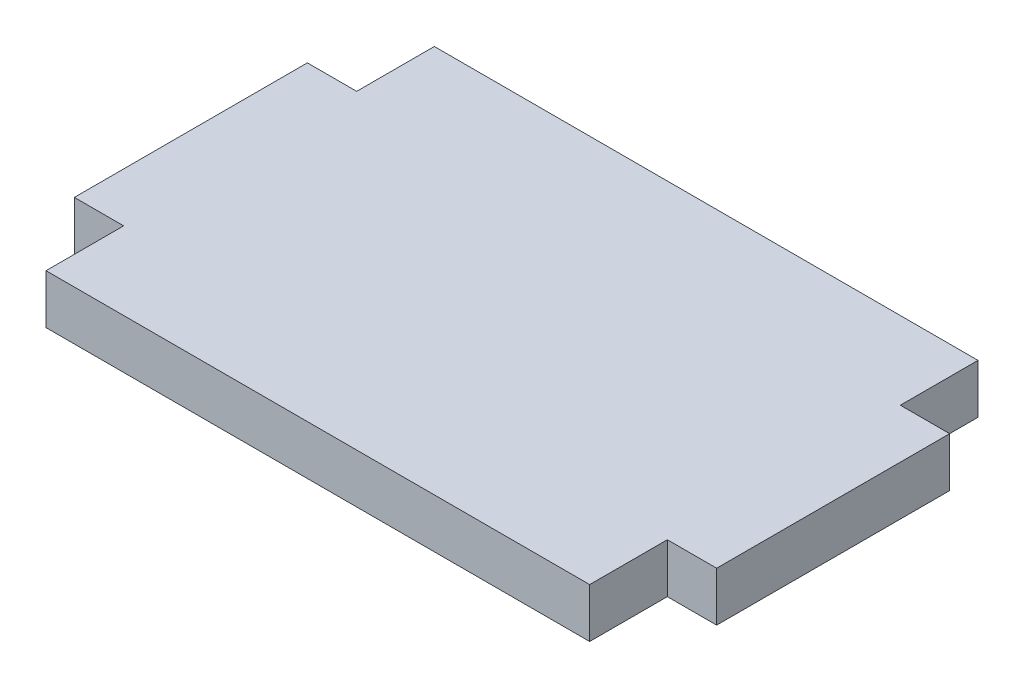
ISO-10303-21;
HEADER;
FILE_DESCRIPTION(('STEP AP214'),'2;1');
FILE_NAME('part.step','',(''),(''),'','','');
FILE_SCHEMA(('AUTOMOTIVE_DESIGN { 1 0 10303 214 1 1 1 1 }'));
ENDSEC;
DATA;
#1=APPLICATION_CONTEXT('core data for automotive mechanical design processes');
#2=APPLICATION_PROTOCOL_DEFINITION('international standard','automotive_design',2000,#1);
#3=PRODUCT_CONTEXT('',#1,'mechanical');
#4=PRODUCT('Part','Part','',(#3));
#5=PRODUCT_RELATED_PRODUCT_CATEGORY('part','',(#4));
#6=PRODUCT_DEFINITION_FORMATION('','',#4);
#7=PRODUCT_DEFINITION_CONTEXT('part definition',#1,'design');
#8=PRODUCT_DEFINITION('design','',#6,#7);
#9=PRODUCT_DEFINITION_SHAPE('','',#8);
#10=(LENGTH_UNIT() NAMED_UNIT(*) SI_UNIT(.MILLI.,.METRE.));
#11=(NAMED_UNIT(*) PLANE_ANGLE_UNIT() SI_UNIT($,.RADIAN.));
#12=(NAMED_UNIT(*) SI_UNIT($,.STERADIAN.) SOLID_ANGLE_UNIT());
#13=UNCERTAINTY_MEASURE_WITH_UNIT(LENGTH_MEASURE(1.E-05),#10,'distance_accuracy_value','');
#14=(GEOMETRIC_REPRESENTATION_CONTEXT(3) GLOBAL_UNCERTAINTY_ASSIGNED_CONTEXT((#13)) GLOBAL_UNIT_ASSIGNED_CONTEXT((#10,
#11,#12)) REPRESENTATION_CONTEXT('',''));
#15=CARTESIAN_POINT('',(0.,0.,0.));
#16=DIRECTION('',(0.,0.,1.));
#17=DIRECTION('',(1.,0.,0.));
#18=AXIS2_PLACEMENT_3D('',#15,#16,#17);
#19=CARTESIAN_POINT('',(-49.0760127478825,6.35,24.4949241036865));
#20=DIRECTION('',(1.,0.,0.));
#21=DIRECTION('',(0.,0.,-1.));
#22=AXIS2_PLACEMENT_3D('',#19,#20,#21);
#23=PLANE('',#22);
#24=DIRECTION('',(0.,0.,1.));
#25=VECTOR('',#24,1.);
#26=CARTESIAN_POINT('',(-49.0760127478825,0.,24.4949241036865));
#27=LINE('',#26,#25);
#28=CARTESIAN_POINT('',(-49.0760127478825,0.,-5.50507589631345));
#29=VERTEX_POINT('',#28);
#30=CARTESIAN_POINT('',(-49.0760127478825,0.,24.4949241036865));
#31=VERTEX_POINT('',#30);
#32=EDGE_CURVE('E151',#29,#31,#27,.T.);
#33=ORIENTED_EDGE('',*,*,#32,.T.);
#34=DIRECTION('',(0.,-1.,0.));
#35=VECTOR('',#34,1.);
#36=CARTESIAN_POINT('',(-49.0760127478825,6.35,24.4949241036865));
#37=LINE('',#36,#35);
#38=CARTESIAN_POINT('',(-49.0760127478825,6.35,24.4949241036865));
#39=VERTEX_POINT('',#38);
#40=EDGE_CURVE('E11',#39,#31,#37,.T.);
#41=ORIENTED_EDGE('',*,*,#40,.F.);
#42=DIRECTION('',(0.,0.,1.));
#43=VECTOR('',#42,1.);
#44=CARTESIAN_POINT('',(-49.0760127478825,6.35,24.4949241036865));
#45=LINE('',#44,#43);
#46=CARTESIAN_POINT('',(-49.0760127478825,6.35,-5.50507589631345));
#47=VERTEX_POINT('',#46);
#48=EDGE_CURVE('E173',#47,#39,#45,.T.);
#49=ORIENTED_EDGE('',*,*,#48,.F.);
#50=DIRECTION('',(0.,-1.,0.));
#51=VECTOR('',#50,1.);
#52=CARTESIAN_POINT('',(-49.0760127478825,6.35,-5.50507589631345));
#53=LINE('',#52,#51);
#54=EDGE_CURVE('E147',#47,#29,#53,.T.);
#55=ORIENTED_EDGE('',*,*,#54,.T.);
#56=EDGE_LOOP('',(#33,#41,#49,#55));
#57=FACE_BOUND('',#56,.T.);
#58=ADVANCED_FACE('F31',(#57),#23,.F.);
#59=CARTESIAN_POINT('',(-42.7260127478825,6.35,24.4949241036865));
#60=DIRECTION('',(0.,0.,-1.));
#61=DIRECTION('',(-1.,0.,0.));
#62=AXIS2_PLACEMENT_3D('',#59,#60,#61);
#63=PLANE('',#62);
#64=DIRECTION('',(1.,0.,0.));
#65=VECTOR('',#64,1.);
#66=CARTESIAN_POINT('',(-42.7260127478825,0.,24.4949241036865));
#67=LINE('',#66,#65);
#68=CARTESIAN_POINT('',(-42.7260127478825,0.,24.4949241036865));
#69=VERTEX_POINT('',#68);
#70=EDGE_CURVE('E154',#31,#69,#67,.T.);
#71=ORIENTED_EDGE('',*,*,#70,.T.);
#72=DIRECTION('',(0.,-1.,0.));
#73=VECTOR('',#72,1.);
#74=CARTESIAN_POINT('',(-42.7260127478825,6.35,24.4949241036865));
#75=LINE('',#74,#73);
#76=CARTESIAN_POINT('',(-42.7260127478825,6.35,24.4949241036865));
#77=VERTEX_POINT('',#76);
#78=EDGE_CURVE('E39',#77,#69,#75,.T.);
#79=ORIENTED_EDGE('',*,*,#78,.F.);
#80=DIRECTION('',(1.,0.,0.));
#81=VECTOR('',#80,1.);
#82=CARTESIAN_POINT('',(-42.7260127478825,6.35,24.4949241036865));
#83=LINE('',#82,#81);
#84=EDGE_CURVE('E102',#39,#77,#83,.T.);
#85=ORIENTED_EDGE('',*,*,#84,.F.);
#86=ORIENTED_EDGE('',*,*,#40,.T.);
#87=EDGE_LOOP('',(#71,#79,#85,#86));
#88=FACE_BOUND('',#87,.T.);
#89=ADVANCED_FACE('F251',(#88),#63,.F.);
#90=CARTESIAN_POINT('',(-42.7260127478825,6.35,34.4949241036866));
#91=DIRECTION('',(1.,0.,0.));
#92=DIRECTION('',(0.,0.,-1.));
#93=AXIS2_PLACEMENT_3D('',#90,#91,#92);
#94=PLANE('',#93);
#95=DIRECTION('',(0.,0.,1.));
#96=VECTOR('',#95,1.);
#97=CARTESIAN_POINT('',(-42.7260127478825,0.,34.4949241036866));
#98=LINE('',#97,#96);
#99=CARTESIAN_POINT('',(-42.7260127478825,0.,34.4949241036866));
#100=VERTEX_POINT('',#99);
#101=EDGE_CURVE('E156',#69,#100,#98,.T.);
#102=ORIENTED_EDGE('',*,*,#101,.T.);
#103=DIRECTION('',(0.,-1.,0.));
#104=VECTOR('',#103,1.);
#105=CARTESIAN_POINT('',(-42.7260127478825,6.35,34.4949241036866));
#106=LINE('',#105,#104);
#107=CARTESIAN_POINT('',(-42.7260127478825,6.35,34.4949241036866));
#108=VERTEX_POINT('',#107);
#109=EDGE_CURVE('E192',#108,#100,#106,.T.);
#110=ORIENTED_EDGE('',*,*,#109,.F.);
#111=DIRECTION('',(0.,0.,1.));
#112=VECTOR('',#111,1.);
#113=CARTESIAN_POINT('',(-42.7260127478825,6.35,34.4949241036866));
#114=LINE('',#113,#112);
#115=EDGE_CURVE('E200',#77,#108,#114,.T.);
#116=ORIENTED_EDGE('',*,*,#115,.F.);
#117=ORIENTED_EDGE('',*,*,#78,.T.);
#118=EDGE_LOOP('',(#102,#110,#116,#117));
#119=FACE_BOUND('',#118,.T.);
#120=ADVANCED_FACE('F198',(#119),#94,.F.);
#121=CARTESIAN_POINT('',(27.2739872521175,6.35,34.4949241036865));
#122=DIRECTION('',(0.,0.,-1.));
#123=DIRECTION('',(-1.,0.,0.));
#124=AXIS2_PLACEMENT_3D('',#121,#122,#123);
#125=PLANE('',#124);
#126=DIRECTION('',(1.,0.,0.));
#127=VECTOR('',#126,1.);
#128=CARTESIAN_POINT('',(27.2739872521175,0.,34.4949241036865));
#129=LINE('',#128,#127);
#130=CARTESIAN_POINT('',(27.2739872521175,0.,34.4949241036865));
#131=VERTEX_POINT('',#130);
#132=EDGE_CURVE('E158',#100,#131,#129,.T.);
#133=ORIENTED_EDGE('',*,*,#132,.T.);
#134=DIRECTION('',(0.,-1.,0.));
#135=VECTOR('',#134,1.);
#136=CARTESIAN_POINT('',(27.2739872521175,6.35,34.4949241036865));
#137=LINE('',#136,#135);
#138=CARTESIAN_POINT('',(27.2739872521175,6.35,34.4949241036865));
#139=VERTEX_POINT('',#138);
#140=EDGE_CURVE('E189',#139,#131,#137,.T.);
#141=ORIENTED_EDGE('',*,*,#140,.F.);
#142=DIRECTION('',(1.,0.,0.));
#143=VECTOR('',#142,1.);
#144=CARTESIAN_POINT('',(27.2739872521175,6.35,34.4949241036865));
#145=LINE('',#144,#143);
#146=EDGE_CURVE('E218',#108,#139,#145,.T.);
#147=ORIENTED_EDGE('',*,*,#146,.F.);
#148=ORIENTED_EDGE('',*,*,#109,.T.);
#149=EDGE_LOOP('',(#133,#141,#147,#148));
#150=FACE_BOUND('',#149,.T.);
#151=ADVANCED_FACE('F209',(#150),#125,.F.);
#152=CARTESIAN_POINT('',(27.2739872521175,6.35,24.4949241036865));
#153=DIRECTION('',(-1.,0.,0.));
#154=DIRECTION('',(0.,0.,1.));
#155=AXIS2_PLACEMENT_3D('',#152,#153,#154);
#156=PLANE('',#155);
#157=DIRECTION('',(0.,0.,-1.));
#158=VECTOR('',#157,1.);
#159=CARTESIAN_POINT('',(27.2739872521175,0.,24.4949241036865));
#160=LINE('',#159,#158);
#161=CARTESIAN_POINT('',(27.2739872521175,0.,24.4949241036865));
#162=VERTEX_POINT('',#161);
#163=EDGE_CURVE('E160',#131,#162,#160,.T.);
#164=ORIENTED_EDGE('',*,*,#163,.T.);
#165=DIRECTION('',(0.,-1.,0.));
#166=VECTOR('',#165,1.);
#167=CARTESIAN_POINT('',(27.2739872521175,6.35,24.4949241036865));
#168=LINE('',#167,#166);
#169=CARTESIAN_POINT('',(27.2739872521175,6.35,24.4949241036865));
#170=VERTEX_POINT('',#169);
#171=EDGE_CURVE('E186',#170,#162,#168,.T.);
#172=ORIENTED_EDGE('',*,*,#171,.F.);
#173=DIRECTION('',(0.,0.,-1.));
#174=VECTOR('',#173,1.);
#175=CARTESIAN_POINT('',(27.2739872521175,6.35,24.4949241036865));
#176=LINE('',#175,#174);
#177=EDGE_CURVE('E215',#139,#170,#176,.T.);
#178=ORIENTED_EDGE('',*,*,#177,.F.);
#179=ORIENTED_EDGE('',*,*,#140,.T.);
#180=EDGE_LOOP('',(#164,#172,#178,#179));
#181=FACE_BOUND('',#180,.T.);
#182=ADVANCED_FACE('F213',(#181),#156,.F.);
#183=CARTESIAN_POINT('',(33.6239872521175,6.35,24.4949241036865));
#184=DIRECTION('',(0.,0.,-1.));
#185=DIRECTION('',(-1.,0.,0.));
#186=AXIS2_PLACEMENT_3D('',#183,#184,#185);
#187=PLANE('',#186);
#188=DIRECTION('',(1.,0.,0.));
#189=VECTOR('',#188,1.);
#190=CARTESIAN_POINT('',(33.6239872521175,0.,24.4949241036865));
#191=LINE('',#190,#189);
#192=CARTESIAN_POINT('',(33.6239872521175,0.,24.4949241036865));
#193=VERTEX_POINT('',#192);
#194=EDGE_CURVE('E162',#162,#193,#191,.T.);
#195=ORIENTED_EDGE('',*,*,#194,.T.);
#196=DIRECTION('',(0.,-1.,0.));
#197=VECTOR('',#196,1.);
#198=CARTESIAN_POINT('',(33.6239872521175,6.35,24.4949241036865));
#199=LINE('',#198,#197);
#200=CARTESIAN_POINT('',(33.6239872521175,6.35,24.4949241036865));
#201=VERTEX_POINT('',#200);
#202=EDGE_CURVE('E183',#201,#193,#199,.T.);
#203=ORIENTED_EDGE('',*,*,#202,.F.);
#204=DIRECTION('',(1.,0.,0.));
#205=VECTOR('',#204,1.);
#206=CARTESIAN_POINT('',(33.6239872521175,6.35,24.4949241036865));
#207=LINE('',#206,#205);
#208=EDGE_CURVE('E217',#170,#201,#207,.T.);
#209=ORIENTED_EDGE('',*,*,#208,.F.);
#210=ORIENTED_EDGE('',*,*,#171,.T.);
#211=EDGE_LOOP('',(#195,#203,#209,#210));
#212=FACE_BOUND('',#211,.T.);
#213=ADVANCED_FACE('F264',(#212),#187,.F.);
#214=CARTESIAN_POINT('',(33.6239872521175,6.35,-5.50507589631345));
#215=DIRECTION('',(-1.,0.,0.));
#216=DIRECTION('',(0.,0.,1.));
#217=AXIS2_PLACEMENT_3D('',#214,#215,#216);
#218=PLANE('',#217);
#219=DIRECTION('',(0.,0.,-1.));
#220=VECTOR('',#219,1.);
#221=CARTESIAN_POINT('',(33.6239872521175,0.,-5.50507589631345));
#222=LINE('',#221,#220);
#223=CARTESIAN_POINT('',(33.6239872521175,0.,-5.50507589631345));
#224=VERTEX_POINT('',#223);
#225=EDGE_CURVE('E164',#193,#224,#222,.T.);
#226=ORIENTED_EDGE('',*,*,#225,.T.);
#227=DIRECTION('',(0.,-1.,0.));
#228=VECTOR('',#227,1.);
#229=CARTESIAN_POINT('',(33.6239872521175,6.35,-5.50507589631345));
#230=LINE('',#229,#228);
#231=CARTESIAN_POINT('',(33.6239872521175,6.35,-5.50507589631345));
#232=VERTEX_POINT('',#231);
#233=EDGE_CURVE('E180',#232,#224,#230,.T.);
#234=ORIENTED_EDGE('',*,*,#233,.F.);
#235=DIRECTION('',(0.,0.,-1.));
#236=VECTOR('',#235,1.);
#237=CARTESIAN_POINT('',(33.6239872521175,6.35,-5.50507589631345));
#238=LINE('',#237,#236);
#239=EDGE_CURVE('E220',#201,#232,#238,.T.);
#240=ORIENTED_EDGE('',*,*,#239,.F.);
#241=ORIENTED_EDGE('',*,*,#202,.T.);
#242=EDGE_LOOP('',(#226,#234,#240,#241));
#243=FACE_BOUND('',#242,.T.);
#244=ADVANCED_FACE('F267',(#243),#218,.F.);
#245=CARTESIAN_POINT('',(27.2739872521175,6.35,-5.50507589631345));
#246=DIRECTION('',(0.,0.,1.));
#247=DIRECTION('',(1.,0.,0.));
#248=AXIS2_PLACEMENT_3D('',#245,#246,#247);
#249=PLANE('',#248);
#250=DIRECTION('',(-1.,0.,0.));
#251=VECTOR('',#250,1.);
#252=CARTESIAN_POINT('',(27.2739872521175,0.,-5.50507589631345));
#253=LINE('',#252,#251);
#254=CARTESIAN_POINT('',(27.2739872521175,0.,-5.50507589631345));
#255=VERTEX_POINT('',#254);
#256=EDGE_CURVE('E166',#224,#255,#253,.T.);
#257=ORIENTED_EDGE('',*,*,#256,.T.);
#258=DIRECTION('',(0.,-1.,0.));
#259=VECTOR('',#258,1.);
#260=CARTESIAN_POINT('',(27.2739872521175,6.35,-5.50507589631345));
#261=LINE('',#260,#259);
#262=CARTESIAN_POINT('',(27.2739872521175,6.35,-5.50507589631345));
#263=VERTEX_POINT('',#262);
#264=EDGE_CURVE('E177',#263,#255,#261,.T.);
#265=ORIENTED_EDGE('',*,*,#264,.F.);
#266=DIRECTION('',(-1.,0.,0.));
#267=VECTOR('',#266,1.);
#268=CARTESIAN_POINT('',(27.2739872521175,6.35,-5.50507589631345));
#269=LINE('',#268,#267);
#270=EDGE_CURVE('E226',#232,#263,#269,.T.);
#271=ORIENTED_EDGE('',*,*,#270,.F.);
#272=ORIENTED_EDGE('',*,*,#233,.T.);
#273=EDGE_LOOP('',(#257,#265,#271,#272));
#274=FACE_BOUND('',#273,.T.);
#275=ADVANCED_FACE('F232',(#274),#249,.F.);
#276=CARTESIAN_POINT('',(27.2739872521175,6.35,-15.5050758963135));
#277=DIRECTION('',(-1.,0.,0.));
#278=DIRECTION('',(0.,0.,1.));
#279=AXIS2_PLACEMENT_3D('',#276,#277,#278);
#280=PLANE('',#279);
#281=DIRECTION('',(0.,0.,-1.));
#282=VECTOR('',#281,1.);
#283=CARTESIAN_POINT('',(27.2739872521175,0.,-15.5050758963135));
#284=LINE('',#283,#282);
#285=CARTESIAN_POINT('',(27.2739872521175,0.,-15.5050758963135));
#286=VERTEX_POINT('',#285);
#287=EDGE_CURVE('E168',#255,#286,#284,.T.);
#288=ORIENTED_EDGE('',*,*,#287,.T.);
#289=DIRECTION('',(0.,-1.,0.));
#290=VECTOR('',#289,1.);
#291=CARTESIAN_POINT('',(27.2739872521175,6.35,-15.5050758963135));
#292=LINE('',#291,#290);
#293=CARTESIAN_POINT('',(27.2739872521175,6.35,-15.5050758963135));
#294=VERTEX_POINT('',#293);
#295=EDGE_CURVE('E142',#294,#286,#292,.T.);
#296=ORIENTED_EDGE('',*,*,#295,.F.);
#297=DIRECTION('',(0.,0.,-1.));
#298=VECTOR('',#297,1.);
#299=CARTESIAN_POINT('',(27.2739872521175,6.35,-15.5050758963135));
#300=LINE('',#299,#298);
#301=EDGE_CURVE('E133',#263,#294,#300,.T.);
#302=ORIENTED_EDGE('',*,*,#301,.F.);
#303=ORIENTED_EDGE('',*,*,#264,.T.);
#304=EDGE_LOOP('',(#288,#296,#302,#303));
#305=FACE_BOUND('',#304,.T.);
#306=ADVANCED_FACE('F236',(#305),#280,.F.);
#307=CARTESIAN_POINT('',(-42.7260127478825,6.35,-15.5050758963135));
#308=DIRECTION('',(0.,0.,1.));
#309=DIRECTION('',(1.,0.,0.));
#310=AXIS2_PLACEMENT_3D('',#307,#308,#309);
#311=PLANE('',#310);
#312=DIRECTION('',(-1.,0.,0.));
#313=VECTOR('',#312,1.);
#314=CARTESIAN_POINT('',(-42.7260127478825,0.,-15.5050758963135));
#315=LINE('',#314,#313);
#316=CARTESIAN_POINT('',(-42.7260127478825,0.,-15.5050758963135));
#317=VERTEX_POINT('',#316);
#318=EDGE_CURVE('E141',#286,#317,#315,.T.);
#319=ORIENTED_EDGE('',*,*,#318,.T.);
#320=DIRECTION('',(0.,-1.,0.));
#321=VECTOR('',#320,1.);
#322=CARTESIAN_POINT('',(-42.7260127478825,6.35,-15.5050758963135));
#323=LINE('',#322,#321);
#324=CARTESIAN_POINT('',(-42.7260127478825,6.35,-15.5050758963135));
#325=VERTEX_POINT('',#324);
#326=EDGE_CURVE('E138',#325,#317,#323,.T.);
#327=ORIENTED_EDGE('',*,*,#326,.F.);
#328=DIRECTION('',(-1.,0.,0.));
#329=VECTOR('',#328,1.);
#330=CARTESIAN_POINT('',(-42.7260127478825,6.35,-15.5050758963135));
#331=LINE('',#330,#329);
#332=EDGE_CURVE('E127',#294,#325,#331,.T.);
#333=ORIENTED_EDGE('',*,*,#332,.F.);
#334=ORIENTED_EDGE('',*,*,#295,.T.);
#335=EDGE_LOOP('',(#319,#327,#333,#334));
#336=FACE_BOUND('',#335,.T.);
#337=ADVANCED_FACE('F139',(#336),#311,.F.);
#338=CARTESIAN_POINT('',(-42.7260127478825,6.35,-5.50507589631345));
#339=DIRECTION('',(1.,0.,0.));
#340=DIRECTION('',(0.,0.,-1.));
#341=AXIS2_PLACEMENT_3D('',#338,#339,#340);
#342=PLANE('',#341);
#343=DIRECTION('',(0.,0.,1.));
#344=VECTOR('',#343,1.);
#345=CARTESIAN_POINT('',(-42.7260127478825,0.,-5.50507589631345));
#346=LINE('',#345,#344);
#347=CARTESIAN_POINT('',(-42.7260127478825,0.,-5.50507589631345));
#348=VERTEX_POINT('',#347);
#349=EDGE_CURVE('E88',#317,#348,#346,.T.);
#350=ORIENTED_EDGE('',*,*,#349,.T.);
#351=DIRECTION('',(0.,-1.,0.));
#352=VECTOR('',#351,1.);
#353=CARTESIAN_POINT('',(-42.7260127478825,6.35,-5.50507589631345));
#354=LINE('',#353,#352);
#355=CARTESIAN_POINT('',(-42.7260127478825,6.35,-5.50507589631345));
#356=VERTEX_POINT('',#355);
#357=EDGE_CURVE('E143',#356,#348,#354,.T.);
#358=ORIENTED_EDGE('',*,*,#357,.F.);
#359=DIRECTION('',(0.,0.,1.));
#360=VECTOR('',#359,1.);
#361=CARTESIAN_POINT('',(-42.7260127478825,6.35,-5.50507589631345));
#362=LINE('',#361,#360);
#363=EDGE_CURVE('E131',#325,#356,#362,.T.);
#364=ORIENTED_EDGE('',*,*,#363,.F.);
#365=ORIENTED_EDGE('',*,*,#326,.T.);
#366=EDGE_LOOP('',(#350,#358,#364,#365));
#367=FACE_BOUND('',#366,.T.);
#368=ADVANCED_FACE('F145',(#367),#342,.F.);
#369=CARTESIAN_POINT('',(-49.0760127478825,6.35,-5.50507589631345));
#370=DIRECTION('',(0.,0.,1.));
#371=DIRECTION('',(1.,0.,0.));
#372=AXIS2_PLACEMENT_3D('',#369,#370,#371);
#373=PLANE('',#372);
#374=DIRECTION('',(-1.,0.,0.));
#375=VECTOR('',#374,1.);
#376=CARTESIAN_POINT('',(-49.0760127478825,0.,-5.50507589631345));
#377=LINE('',#376,#375);
#378=EDGE_CURVE('E94',#348,#29,#377,.T.);
#379=ORIENTED_EDGE('',*,*,#378,.T.);
#380=ORIENTED_EDGE('',*,*,#54,.F.);
#381=DIRECTION('',(-1.,0.,0.));
#382=VECTOR('',#381,1.);
#383=CARTESIAN_POINT('',(-49.0760127478825,6.35,-5.50507589631345));
#384=LINE('',#383,#382);
#385=EDGE_CURVE('E47',#356,#47,#384,.T.);
#386=ORIENTED_EDGE('',*,*,#385,.F.);
#387=ORIENTED_EDGE('',*,*,#357,.T.);
#388=EDGE_LOOP('',(#379,#380,#386,#387));
#389=FACE_BOUND('',#388,.T.);
#390=ADVANCED_FACE('F240',(#389),#373,.F.);
#391=CARTESIAN_POINT('',(-49.0760127478825,6.35,-5.50507589631345));
#392=DIRECTION('',(0.,-1.,0.));
#393=DIRECTION('',(0.,0.,-1.));
#394=AXIS2_PLACEMENT_3D('',#391,#392,#393);
#395=PLANE('',#394);
#396=ORIENTED_EDGE('',*,*,#48,.T.);
#397=ORIENTED_EDGE('',*,*,#84,.T.);
#398=ORIENTED_EDGE('',*,*,#115,.T.);
#399=ORIENTED_EDGE('',*,*,#146,.T.);
#400=ORIENTED_EDGE('',*,*,#177,.T.);
#401=ORIENTED_EDGE('',*,*,#208,.T.);
#402=ORIENTED_EDGE('',*,*,#239,.T.);
#403=ORIENTED_EDGE('',*,*,#270,.T.);
#404=ORIENTED_EDGE('',*,*,#301,.T.);
#405=ORIENTED_EDGE('',*,*,#332,.T.);
#406=ORIENTED_EDGE('',*,*,#363,.T.);
#407=ORIENTED_EDGE('',*,*,#385,.T.);
#408=EDGE_LOOP('',(#396,#397,#398,#399,#400,#401,#402,#403,#404,#405,#406,#407));
#409=FACE_BOUND('',#408,.T.);
#410=ADVANCED_FACE('F129',(#409),#395,.F.);
#411=CARTESIAN_POINT('',(-49.0760127478825,0.,-5.50507589631345));
#412=DIRECTION('',(0.,-1.,0.));
#413=DIRECTION('',(0.,0.,-1.));
#414=AXIS2_PLACEMENT_3D('',#411,#412,#413);
#415=PLANE('',#414);
#416=ORIENTED_EDGE('',*,*,#32,.F.);
#417=ORIENTED_EDGE('',*,*,#378,.F.);
#418=ORIENTED_EDGE('',*,*,#349,.F.);
#419=ORIENTED_EDGE('',*,*,#318,.F.);
#420=ORIENTED_EDGE('',*,*,#287,.F.);
#421=ORIENTED_EDGE('',*,*,#256,.F.);
#422=ORIENTED_EDGE('',*,*,#225,.F.);
#423=ORIENTED_EDGE('',*,*,#194,.F.);
#424=ORIENTED_EDGE('',*,*,#163,.F.);
#425=ORIENTED_EDGE('',*,*,#132,.F.);
#426=ORIENTED_EDGE('',*,*,#101,.F.);
#427=ORIENTED_EDGE('',*,*,#70,.F.);
#428=EDGE_LOOP('',(#416,#417,#418,#419,#420,#421,#422,#423,#424,#425,#426,#427));
#429=FACE_BOUND('',#428,.T.);
#430=ADVANCED_FACE('F204',(#429),#415,.T.);
#431=CLOSED_SHELL('',(#58,#89,#120,#151,#182,#213,#244,#275,#306,#337,#368,#390,#410,#430));
#432=MANIFOLD_SOLID_BREP('B2',#431);
#433=ADVANCED_BREP_SHAPE_REPRESENTATION('',(#18,#432),#14);
#434=SHAPE_DEFINITION_REPRESENTATION(#9,#433);
ENDSEC;
END-ISO-10303-21;
